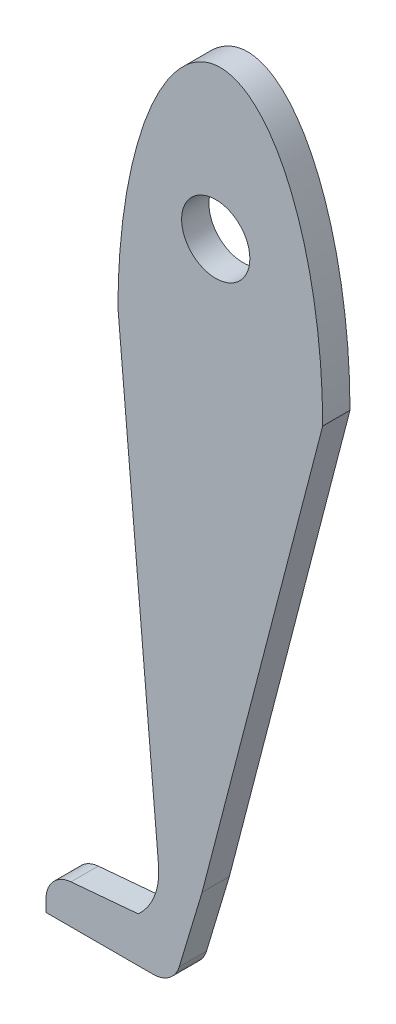
ISO-10303-21;
HEADER;
FILE_DESCRIPTION(('STEP AP214'),'2;1');
FILE_NAME('part.step','',(''),(''),'','','');
FILE_SCHEMA(('AUTOMOTIVE_DESIGN { 1 0 10303 214 1 1 1 1 }'));
ENDSEC;
DATA;
#1=APPLICATION_CONTEXT('core data for automotive mechanical design processes');
#2=APPLICATION_PROTOCOL_DEFINITION('international standard','automotive_design',2000,#1);
#3=PRODUCT_CONTEXT('',#1,'mechanical');
#4=PRODUCT('Part','Part','',(#3));
#5=PRODUCT_RELATED_PRODUCT_CATEGORY('part','',(#4));
#6=PRODUCT_DEFINITION_FORMATION('','',#4);
#7=PRODUCT_DEFINITION_CONTEXT('part definition',#1,'design');
#8=PRODUCT_DEFINITION('design','',#6,#7);
#9=PRODUCT_DEFINITION_SHAPE('','',#8);
#10=(LENGTH_UNIT() NAMED_UNIT(*) SI_UNIT(.MILLI.,.METRE.));
#11=(NAMED_UNIT(*) PLANE_ANGLE_UNIT() SI_UNIT($,.RADIAN.));
#12=(NAMED_UNIT(*) SI_UNIT($,.STERADIAN.) SOLID_ANGLE_UNIT());
#13=UNCERTAINTY_MEASURE_WITH_UNIT(LENGTH_MEASURE(1.E-05),#10,'distance_accuracy_value','');
#14=(GEOMETRIC_REPRESENTATION_CONTEXT(3) GLOBAL_UNCERTAINTY_ASSIGNED_CONTEXT((#13)) GLOBAL_UNIT_ASSIGNED_CONTEXT((#10,
#11,#12)) REPRESENTATION_CONTEXT('',''));
#15=CARTESIAN_POINT('',(0.,0.,0.));
#16=DIRECTION('',(0.,0.,1.));
#17=DIRECTION('',(1.,0.,0.));
#18=AXIS2_PLACEMENT_3D('',#15,#16,#17);
#19=CARTESIAN_POINT('',(-2.1062895464308,-7.,2.));
#20=DIRECTION('',(-0.957589152564701,0.288137145974652,0.));
#21=DIRECTION('',(-0.288137145974652,-0.957589152564701,0.));
#22=AXIS2_PLACEMENT_3D('',#19,#20,#21);
#23=PLANE('',#22);
#24=DIRECTION('',(0.288137145974652,0.957589152564701,0.));
#25=VECTOR('',#24,1.);
#26=CARTESIAN_POINT('',(-2.1062895464308,-7.,2.));
#27=LINE('',#26,#25);
#28=CARTESIAN_POINT('',(-1.67789260702338,-5.5762742919493,2.));
#29=VERTEX_POINT('',#28);
#30=CARTESIAN_POINT('',(0.,0.,2.));
#31=VERTEX_POINT('',#30);
#32=EDGE_CURVE('E146',#29,#31,#27,.T.);
#33=ORIENTED_EDGE('',*,*,#32,.F.);
#34=DIRECTION('',(0.,0.,-1.));
#35=VECTOR('',#34,1.);
#36=CARTESIAN_POINT('',(-1.67789260702338,-5.5762742919493,2.));
#37=LINE('',#36,#35);
#38=CARTESIAN_POINT('',(-1.67789260702338,-5.5762742919493,0.));
#39=VERTEX_POINT('',#38);
#40=EDGE_CURVE('E168',#29,#39,#37,.T.);
#41=ORIENTED_EDGE('',*,*,#40,.T.);
#42=DIRECTION('',(0.288137145974652,0.957589152564701,0.));
#43=VECTOR('',#42,1.);
#44=CARTESIAN_POINT('',(-2.1062895464308,-7.,0.));
#45=LINE('',#44,#43);
#46=CARTESIAN_POINT('',(0.,0.,0.));
#47=VERTEX_POINT('',#46);
#48=EDGE_CURVE('E120',#39,#47,#45,.T.);
#49=ORIENTED_EDGE('',*,*,#48,.T.);
#50=DIRECTION('',(0.,0.,-1.));
#51=VECTOR('',#50,1.);
#52=CARTESIAN_POINT('',(0.,0.,2.));
#53=LINE('',#52,#51);
#54=EDGE_CURVE('E157',#31,#47,#53,.T.);
#55=ORIENTED_EDGE('',*,*,#54,.F.);
#56=EDGE_LOOP('',(#33,#41,#49,#55));
#57=FACE_BOUND('',#56,.T.);
#58=ADVANCED_FACE('F34',(#57),#23,.F.);
#59=CARTESIAN_POINT('',(0.,0.,2.));
#60=DIRECTION('',(-0.96784691213223,0.251539966359438,0.));
#61=DIRECTION('',(-0.251539966359438,-0.96784691213223,0.));
#62=AXIS2_PLACEMENT_3D('',#59,#60,#61);
#63=PLANE('',#62);
#64=DIRECTION('',(0.251539966359438,0.96784691213223,0.));
#65=VECTOR('',#64,1.);
#66=CARTESIAN_POINT('',(0.,0.,0.));
#67=LINE('',#66,#65);
#68=CARTESIAN_POINT('',(8.83647894002109,34.,0.));
#69=VERTEX_POINT('',#68);
#70=EDGE_CURVE('E179',#47,#69,#67,.T.);
#71=ORIENTED_EDGE('',*,*,#70,.T.);
#72=DIRECTION('',(0.,0.,-1.));
#73=VECTOR('',#72,1.);
#74=CARTESIAN_POINT('',(8.83647894002109,34.,2.));
#75=LINE('',#74,#73);
#76=CARTESIAN_POINT('',(8.83647894002109,34.,2.));
#77=VERTEX_POINT('',#76);
#78=EDGE_CURVE('E154',#77,#69,#75,.T.);
#79=ORIENTED_EDGE('',*,*,#78,.F.);
#80=DIRECTION('',(0.251539966359438,0.96784691213223,0.));
#81=VECTOR('',#80,1.);
#82=CARTESIAN_POINT('',(0.,0.,2.));
#83=LINE('',#82,#81);
#84=EDGE_CURVE('E199',#31,#77,#83,.T.);
#85=ORIENTED_EDGE('',*,*,#84,.F.);
#86=ORIENTED_EDGE('',*,*,#54,.T.);
#87=EDGE_LOOP('',(#71,#79,#85,#86));
#88=FACE_BOUND('',#87,.T.);
#89=ADVANCED_FACE('F216',(#88),#63,.F.);
#90=CARTESIAN_POINT('',(1.33647894002109,34.,2.));
#91=DIRECTION('',(0.,0.,1.));
#92=DIRECTION('',(0.,1.,0.));
#93=AXIS2_PLACEMENT_3D('',#90,#91,#92);
#94=ELLIPSE('',#93,19.,7.5);
#95=DIRECTION('',(0.,0.,-1.));
#96=VECTOR('',#95,1.);
#97=SURFACE_OF_LINEAR_EXTRUSION('',#94,#96);
#98=CARTESIAN_POINT('',(1.33647894002109,34.,0.));
#99=DIRECTION('',(0.,0.,1.));
#100=DIRECTION('',(0.,1.,0.));
#101=AXIS2_PLACEMENT_3D('',#98,#99,#100);
#102=ELLIPSE('',#101,19.,7.5);
#103=CARTESIAN_POINT('',(-6.16352105997891,34.,0.));
#104=VERTEX_POINT('',#103);
#105=EDGE_CURVE('E141',#69,#104,#102,.T.);
#106=ORIENTED_EDGE('',*,*,#105,.T.);
#107=DIRECTION('',(0.,0.,-1.));
#108=VECTOR('',#107,1.);
#109=CARTESIAN_POINT('',(-6.16352105997891,34.,2.));
#110=LINE('',#109,#108);
#111=CARTESIAN_POINT('',(-6.16352105997891,34.,2.));
#112=VERTEX_POINT('',#111);
#113=EDGE_CURVE('E151',#112,#104,#110,.T.);
#114=ORIENTED_EDGE('',*,*,#113,.F.);
#115=EDGE_CURVE('E195',#77,#112,#94,.T.);
#116=ORIENTED_EDGE('',*,*,#115,.F.);
#117=ORIENTED_EDGE('',*,*,#78,.T.);
#118=EDGE_LOOP('',(#106,#114,#116,#117));
#119=FACE_BOUND('',#118,.T.);
#120=ADVANCED_FACE('F186',(#119),#97,.F.);
#121=CARTESIAN_POINT('',(-6.16352105997891,34.,2.));
#122=DIRECTION('',(0.99617267736109,0.0874070756817692,0.));
#123=DIRECTION('',(-0.0874070756817692,0.99617267736109,0.));
#124=AXIS2_PLACEMENT_3D('',#121,#122,#123);
#125=PLANE('',#124);
#126=DIRECTION('',(0.0874070756817692,-0.99617267736109,0.));
#127=VECTOR('',#126,1.);
#128=CARTESIAN_POINT('',(-6.16352105997891,34.,0.));
#129=LINE('',#128,#127);
#130=CARTESIAN_POINT('',(-3.18026259413471,0.,0.));
#131=VERTEX_POINT('',#130);
#132=EDGE_CURVE('E137',#104,#131,#129,.T.);
#133=ORIENTED_EDGE('',*,*,#132,.T.);
#134=DIRECTION('',(0.,0.,-1.));
#135=VECTOR('',#134,1.);
#136=CARTESIAN_POINT('',(-3.18026259413471,0.,2.));
#137=LINE('',#136,#135);
#138=CARTESIAN_POINT('',(-3.18026259413471,0.,2.));
#139=VERTEX_POINT('',#138);
#140=EDGE_CURVE('E116',#139,#131,#137,.T.);
#141=ORIENTED_EDGE('',*,*,#140,.F.);
#142=DIRECTION('',(0.0874070756817692,-0.99617267736109,0.));
#143=VECTOR('',#142,1.);
#144=CARTESIAN_POINT('',(-6.16352105997891,34.,2.));
#145=LINE('',#144,#143);
#146=EDGE_CURVE('E193',#112,#139,#145,.T.);
#147=ORIENTED_EDGE('',*,*,#146,.F.);
#148=ORIENTED_EDGE('',*,*,#113,.T.);
#149=EDGE_LOOP('',(#133,#141,#147,#148));
#150=FACE_BOUND('',#149,.T.);
#151=ADVANCED_FACE('F191',(#150),#125,.F.);
#152=CARTESIAN_POINT('',(-4.67189182705681,-3.70838700827069,2.));
#153=DIRECTION('',(0.0874070756817693,-0.996172677361089,0.));
#154=DIRECTION('',(0.99617267736109,0.0874070756817693,0.));
#155=AXIS2_PLACEMENT_3D('',#152,#153,#154);
#156=PLANE('',#155);
#157=DIRECTION('',(-0.99617267736109,-0.0874070756817693,0.));
#158=VECTOR('',#157,1.);
#159=CARTESIAN_POINT('',(-4.67189182705681,-3.70838700827069,0.));
#160=LINE('',#159,#158);
#161=CARTESIAN_POINT('',(-4.67189182705681,-3.70838700827068,0.));
#162=VERTEX_POINT('',#161);
#163=CARTESIAN_POINT('',(-9.61009276858463,-4.14167906017812,0.));
#164=VERTEX_POINT('',#163);
#165=EDGE_CURVE('E127',#162,#164,#160,.T.);
#166=ORIENTED_EDGE('',*,*,#165,.T.);
#167=DIRECTION('',(0.,0.,-1.));
#168=VECTOR('',#167,1.);
#169=CARTESIAN_POINT('',(-9.61009276858463,-4.14167906017812,2.));
#170=LINE('',#169,#168);
#171=CARTESIAN_POINT('',(-9.61009276858463,-4.14167906017812,2.));
#172=VERTEX_POINT('',#171);
#173=EDGE_CURVE('E164',#164,#172,#170,.F.);
#174=ORIENTED_EDGE('',*,*,#173,.T.);
#175=DIRECTION('',(-0.99617267736109,-0.0874070756817693,0.));
#176=VECTOR('',#175,1.);
#177=CARTESIAN_POINT('',(-4.67189182705681,-3.70838700827069,2.));
#178=LINE('',#177,#176);
#179=CARTESIAN_POINT('',(-4.67189182705681,-3.70838700827068,2.));
#180=VERTEX_POINT('',#179);
#181=EDGE_CURVE('E130',#180,#172,#178,.T.);
#182=ORIENTED_EDGE('',*,*,#181,.F.);
#183=DIRECTION('',(0.,0.,-1.));
#184=VECTOR('',#183,1.);
#185=CARTESIAN_POINT('',(-4.67189182705681,-3.70838700827069,2.));
#186=LINE('',#185,#184);
#187=EDGE_CURVE('E113',#180,#162,#186,.T.);
#188=ORIENTED_EDGE('',*,*,#187,.T.);
#189=EDGE_LOOP('',(#166,#174,#182,#188));
#190=FACE_BOUND('',#189,.T.);
#191=ADVANCED_FACE('F126',(#190),#156,.F.);
#192=CARTESIAN_POINT('',(-11.4352786172211,-4.3018261523747,2.));
#193=DIRECTION('',(1.,0.,0.));
#194=DIRECTION('',(0.,0.,-1.));
#195=AXIS2_PLACEMENT_3D('',#192,#193,#194);
#196=PLANE('',#195);
#197=DIRECTION('',(0.,-1.,0.));
#198=VECTOR('',#197,1.);
#199=CARTESIAN_POINT('',(-11.4352786172211,-4.3018261523747,2.));
#200=LINE('',#199,#198);
#201=CARTESIAN_POINT('',(-11.4352786172211,-6.1340244149003,2.));
#202=VERTEX_POINT('',#201);
#203=CARTESIAN_POINT('',(-11.4352786172211,-7.,2.));
#204=VERTEX_POINT('',#203);
#205=EDGE_CURVE('E197',#202,#204,#200,.T.);
#206=ORIENTED_EDGE('',*,*,#205,.F.);
#207=DIRECTION('',(0.,0.,-1.));
#208=VECTOR('',#207,1.);
#209=CARTESIAN_POINT('',(-11.4352786172211,-6.1340244149003,2.));
#210=LINE('',#209,#208);
#211=CARTESIAN_POINT('',(-11.4352786172211,-6.1340244149003,0.));
#212=VERTEX_POINT('',#211);
#213=EDGE_CURVE('E160',#202,#212,#210,.T.);
#214=ORIENTED_EDGE('',*,*,#213,.T.);
#215=DIRECTION('',(0.,-1.,0.));
#216=VECTOR('',#215,1.);
#217=CARTESIAN_POINT('',(-11.4352786172211,-4.3018261523747,0.));
#218=LINE('',#217,#216);
#219=CARTESIAN_POINT('',(-11.4352786172211,-7.,0.));
#220=VERTEX_POINT('',#219);
#221=EDGE_CURVE('E136',#212,#220,#218,.T.);
#222=ORIENTED_EDGE('',*,*,#221,.T.);
#223=DIRECTION('',(0.,0.,-1.));
#224=VECTOR('',#223,1.);
#225=CARTESIAN_POINT('',(-11.4352786172211,-7.,2.));
#226=LINE('',#225,#224);
#227=EDGE_CURVE('E131',#204,#220,#226,.T.);
#228=ORIENTED_EDGE('',*,*,#227,.F.);
#229=EDGE_LOOP('',(#206,#214,#222,#228));
#230=FACE_BOUND('',#229,.T.);
#231=ADVANCED_FACE('F230',(#230),#196,.F.);
#232=CARTESIAN_POINT('',(-11.4352786172211,-7.,2.));
#233=DIRECTION('',(0.,1.,0.));
#234=DIRECTION('',(0.,0.,1.));
#235=AXIS2_PLACEMENT_3D('',#232,#233,#234);
#236=PLANE('',#235);
#237=DIRECTION('',(1.,0.,0.));
#238=VECTOR('',#237,1.);
#239=CARTESIAN_POINT('',(-11.4352786172211,-7.,0.));
#240=LINE('',#239,#238);
#241=CARTESIAN_POINT('',(-3.59307091215278,-7.,0.));
#242=VERTEX_POINT('',#241);
#243=EDGE_CURVE('E139',#220,#242,#240,.T.);
#244=ORIENTED_EDGE('',*,*,#243,.T.);
#245=DIRECTION('',(0.,0.,-1.));
#246=VECTOR('',#245,1.);
#247=CARTESIAN_POINT('',(-3.59307091215278,-7.,2.));
#248=LINE('',#247,#246);
#249=CARTESIAN_POINT('',(-3.59307091215278,-7.,2.));
#250=VERTEX_POINT('',#249);
#251=EDGE_CURVE('E42',#242,#250,#248,.F.);
#252=ORIENTED_EDGE('',*,*,#251,.T.);
#253=DIRECTION('',(1.,0.,0.));
#254=VECTOR('',#253,1.);
#255=CARTESIAN_POINT('',(-11.4352786172211,-7.,2.));
#256=LINE('',#255,#254);
#257=EDGE_CURVE('E148',#204,#250,#256,.T.);
#258=ORIENTED_EDGE('',*,*,#257,.F.);
#259=ORIENTED_EDGE('',*,*,#227,.T.);
#260=EDGE_LOOP('',(#244,#252,#258,#259));
#261=FACE_BOUND('',#260,.T.);
#262=ADVANCED_FACE('F233',(#261),#236,.F.);
#263=CARTESIAN_POINT('',(1.33647894002109,34.,2.));
#264=DIRECTION('',(0.,0.,1.));
#265=DIRECTION('',(1.,0.,0.));
#266=AXIS2_PLACEMENT_3D('',#263,#264,#265);
#267=PLANE('',#266);
#268=CARTESIAN_POINT('',(1.,41.95,2.));
#269=DIRECTION('',(0.,0.,1.));
#270=DIRECTION('',(1.,0.,0.));
#271=AXIS2_PLACEMENT_3D('',#268,#269,#270);
#272=CIRCLE('',#271,2.5);
#273=CARTESIAN_POINT('',(3.5,41.95,2.));
#274=VERTEX_POINT('',#273);
#275=EDGE_CURVE('E253',#274,#274,#272,.T.);
#276=ORIENTED_EDGE('',*,*,#275,.F.);
#277=EDGE_LOOP('',(#276));
#278=FACE_BOUND('',#277,.T.);
#279=CARTESIAN_POINT('',(-7.77918867934636,-0.304351567013475,2.));
#280=DIRECTION('',(0.,0.,1.));
#281=DIRECTION('',(-1.,0.,0.));
#282=AXIS2_PLACEMENT_3D('',#279,#280,#281);
#283=CIRCLE('',#282,4.60898589860977);
#284=EDGE_CURVE('E121',#180,#139,#283,.T.);
#285=ORIENTED_EDGE('',*,*,#284,.F.);
#286=ORIENTED_EDGE('',*,*,#181,.T.);
#287=CARTESIAN_POINT('',(-9.43527861722109,-6.1340244149003,2.));
#288=DIRECTION('',(0.,0.,1.));
#289=DIRECTION('',(1.,0.,0.));
#290=AXIS2_PLACEMENT_3D('',#287,#288,#289);
#291=CIRCLE('',#290,2.);
#292=EDGE_CURVE('E166',#172,#202,#291,.T.);
#293=ORIENTED_EDGE('',*,*,#292,.T.);
#294=ORIENTED_EDGE('',*,*,#205,.T.);
#295=ORIENTED_EDGE('',*,*,#257,.T.);
#296=CARTESIAN_POINT('',(-3.59307091215278,-5.,2.));
#297=DIRECTION('',(0.,0.,1.));
#298=DIRECTION('',(1.,0.,0.));
#299=AXIS2_PLACEMENT_3D('',#296,#297,#298);
#300=CIRCLE('',#299,2.);
#301=EDGE_CURVE('E11',#250,#29,#300,.T.);
#302=ORIENTED_EDGE('',*,*,#301,.T.);
#303=ORIENTED_EDGE('',*,*,#32,.T.);
#304=ORIENTED_EDGE('',*,*,#84,.T.);
#305=ORIENTED_EDGE('',*,*,#115,.T.);
#306=ORIENTED_EDGE('',*,*,#146,.T.);
#307=EDGE_LOOP('',(#285,#286,#293,#294,#295,#302,#303,#304,#305,#306));
#308=FACE_BOUND('',#307,.T.);
#309=ADVANCED_FACE('F205',(#278,#308),#267,.T.);
#310=CARTESIAN_POINT('',(1.33647894002109,34.,0.));
#311=DIRECTION('',(0.,0.,1.));
#312=DIRECTION('',(1.,0.,0.));
#313=AXIS2_PLACEMENT_3D('',#310,#311,#312);
#314=PLANE('',#313);
#315=CARTESIAN_POINT('',(1.,41.95,0.));
#316=DIRECTION('',(0.,0.,1.));
#317=DIRECTION('',(1.,0.,0.));
#318=AXIS2_PLACEMENT_3D('',#315,#316,#317);
#319=CIRCLE('',#318,2.5);
#320=CARTESIAN_POINT('',(3.5,41.95,0.));
#321=VERTEX_POINT('',#320);
#322=EDGE_CURVE('E250',#321,#321,#319,.T.);
#323=ORIENTED_EDGE('',*,*,#322,.T.);
#324=EDGE_LOOP('',(#323));
#325=FACE_BOUND('',#324,.T.);
#326=ORIENTED_EDGE('',*,*,#165,.F.);
#327=CARTESIAN_POINT('',(-7.77918867934636,-0.304351567013475,0.));
#328=DIRECTION('',(0.,0.,1.));
#329=DIRECTION('',(-1.,0.,0.));
#330=AXIS2_PLACEMENT_3D('',#327,#328,#329);
#331=CIRCLE('',#330,4.60898589860977);
#332=EDGE_CURVE('E110',#162,#131,#331,.T.);
#333=ORIENTED_EDGE('',*,*,#332,.T.);
#334=ORIENTED_EDGE('',*,*,#132,.F.);
#335=ORIENTED_EDGE('',*,*,#105,.F.);
#336=ORIENTED_EDGE('',*,*,#70,.F.);
#337=ORIENTED_EDGE('',*,*,#48,.F.);
#338=CARTESIAN_POINT('',(-3.59307091215278,-5.,0.));
#339=DIRECTION('',(0.,0.,1.));
#340=DIRECTION('',(1.,0.,0.));
#341=AXIS2_PLACEMENT_3D('',#338,#339,#340);
#342=CIRCLE('',#341,2.);
#343=EDGE_CURVE('E56',#39,#242,#342,.F.);
#344=ORIENTED_EDGE('',*,*,#343,.T.);
#345=ORIENTED_EDGE('',*,*,#243,.F.);
#346=ORIENTED_EDGE('',*,*,#221,.F.);
#347=CARTESIAN_POINT('',(-9.43527861722109,-6.1340244149003,0.));
#348=DIRECTION('',(0.,0.,1.));
#349=DIRECTION('',(1.,0.,0.));
#350=AXIS2_PLACEMENT_3D('',#347,#348,#349);
#351=CIRCLE('',#350,2.);
#352=EDGE_CURVE('E135',#212,#164,#351,.F.);
#353=ORIENTED_EDGE('',*,*,#352,.T.);
#354=EDGE_LOOP('',(#326,#333,#334,#335,#336,#337,#344,#345,#346,#353));
#355=FACE_BOUND('',#354,.T.);
#356=ADVANCED_FACE('F133',(#325,#355),#314,.F.);
#357=CARTESIAN_POINT('',(-9.43527861722109,-6.1340244149003,2.));
#358=DIRECTION('',(0.,0.,-1.));
#359=DIRECTION('',(-1.,0.,0.));
#360=AXIS2_PLACEMENT_3D('',#357,#358,#359);
#361=CYLINDRICAL_SURFACE('',#360,2.);
#362=ORIENTED_EDGE('',*,*,#292,.F.);
#363=ORIENTED_EDGE('',*,*,#173,.F.);
#364=ORIENTED_EDGE('',*,*,#352,.F.);
#365=ORIENTED_EDGE('',*,*,#213,.F.);
#366=EDGE_LOOP('',(#362,#363,#364,#365));
#367=FACE_BOUND('',#366,.T.);
#368=ADVANCED_FACE('F207',(#367),#361,.T.);
#369=CARTESIAN_POINT('',(-3.59307091215278,-5.,2.));
#370=DIRECTION('',(0.,0.,-1.));
#371=DIRECTION('',(-1.,0.,0.));
#372=AXIS2_PLACEMENT_3D('',#369,#370,#371);
#373=CYLINDRICAL_SURFACE('',#372,2.);
#374=ORIENTED_EDGE('',*,*,#301,.F.);
#375=ORIENTED_EDGE('',*,*,#251,.F.);
#376=ORIENTED_EDGE('',*,*,#343,.F.);
#377=ORIENTED_EDGE('',*,*,#40,.F.);
#378=EDGE_LOOP('',(#374,#375,#376,#377));
#379=FACE_BOUND('',#378,.T.);
#380=ADVANCED_FACE('F36',(#379),#373,.T.);
#381=CARTESIAN_POINT('',(-7.77918867934636,-0.304351567013475,0.));
#382=DIRECTION('',(0.,0.,1.));
#383=DIRECTION('',(1.,0.,0.));
#384=AXIS2_PLACEMENT_3D('',#381,#382,#383);
#385=CYLINDRICAL_SURFACE('',#384,4.60898589860977);
#386=ORIENTED_EDGE('',*,*,#284,.T.);
#387=ORIENTED_EDGE('',*,*,#140,.T.);
#388=ORIENTED_EDGE('',*,*,#332,.F.);
#389=ORIENTED_EDGE('',*,*,#187,.F.);
#390=EDGE_LOOP('',(#386,#387,#388,#389));
#391=FACE_BOUND('',#390,.T.);
#392=ADVANCED_FACE('F112',(#391),#385,.F.);
#393=CARTESIAN_POINT('',(1.,41.95,0.));
#394=DIRECTION('',(0.,0.,1.));
#395=DIRECTION('',(1.,0.,0.));
#396=AXIS2_PLACEMENT_3D('',#393,#394,#395);
#397=CYLINDRICAL_SURFACE('',#396,2.5);
#398=ORIENTED_EDGE('',*,*,#322,.F.);
#399=EDGE_LOOP('',(#398));
#400=FACE_BOUND('',#399,.T.);
#401=ORIENTED_EDGE('',*,*,#275,.T.);
#402=EDGE_LOOP('',(#401));
#403=FACE_BOUND('',#402,.T.);
#404=ADVANCED_FACE('F212',(#400,#403),#397,.F.);
#405=CLOSED_SHELL('',(#58,#89,#120,#151,#191,#231,#262,#309,#356,#368,#380,#392,#404));
#406=MANIFOLD_SOLID_BREP('B2',#405);
#407=ADVANCED_BREP_SHAPE_REPRESENTATION('',(#18,#406),#14);
#408=SHAPE_DEFINITION_REPRESENTATION(#9,#407);
ENDSEC;
END-ISO-10303-21;
